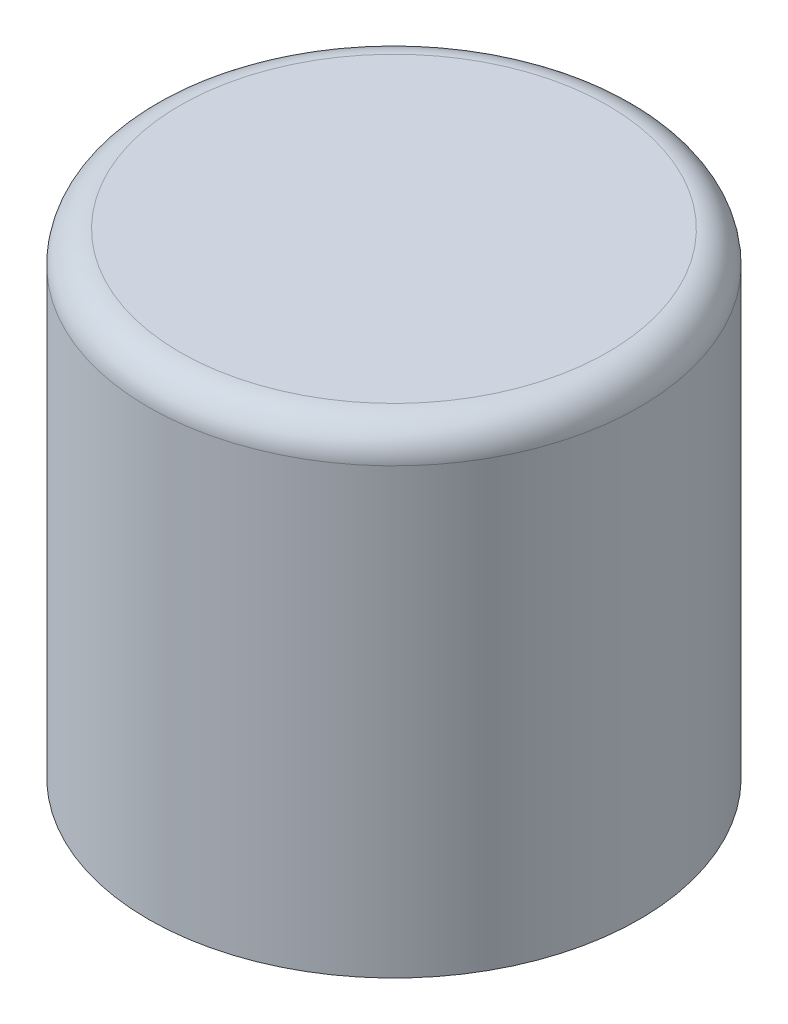
ISO-10303-21;
HEADER;
FILE_DESCRIPTION(('STEP AP214'),'2;1');
FILE_NAME('part.step','',(''),(''),'','','');
FILE_SCHEMA(('AUTOMOTIVE_DESIGN { 1 0 10303 214 1 1 1 1 }'));
ENDSEC;
DATA;
#1=APPLICATION_CONTEXT('core data for automotive mechanical design processes');
#2=APPLICATION_PROTOCOL_DEFINITION('international standard','automotive_design',2000,#1);
#3=PRODUCT_CONTEXT('',#1,'mechanical');
#4=PRODUCT('Part','Part','',(#3));
#5=PRODUCT_RELATED_PRODUCT_CATEGORY('part','',(#4));
#6=PRODUCT_DEFINITION_FORMATION('','',#4);
#7=PRODUCT_DEFINITION_CONTEXT('part definition',#1,'design');
#8=PRODUCT_DEFINITION('design','',#6,#7);
#9=PRODUCT_DEFINITION_SHAPE('','',#8);
#10=(LENGTH_UNIT() NAMED_UNIT(*) SI_UNIT(.MILLI.,.METRE.));
#11=(NAMED_UNIT(*) PLANE_ANGLE_UNIT() SI_UNIT($,.RADIAN.));
#12=(NAMED_UNIT(*) SI_UNIT($,.STERADIAN.) SOLID_ANGLE_UNIT());
#13=UNCERTAINTY_MEASURE_WITH_UNIT(LENGTH_MEASURE(1.E-05),#10,'distance_accuracy_value','');
#14=(GEOMETRIC_REPRESENTATION_CONTEXT(3) GLOBAL_UNCERTAINTY_ASSIGNED_CONTEXT((#13)) GLOBAL_UNIT_ASSIGNED_CONTEXT((#10,
#11,#12)) REPRESENTATION_CONTEXT('',''));
#15=CARTESIAN_POINT('',(0.,0.,0.));
#16=DIRECTION('',(0.,0.,1.));
#17=DIRECTION('',(1.,0.,0.));
#18=AXIS2_PLACEMENT_3D('',#15,#16,#17);
#19=CARTESIAN_POINT('',(0.,0.,0.));
#20=DIRECTION('',(0.,1.,0.));
#21=DIRECTION('',(0.,0.,1.));
#22=AXIS2_PLACEMENT_3D('',#19,#20,#21);
#23=PLANE('',#22);
#24=CARTESIAN_POINT('',(0.,0.,0.));
#25=DIRECTION('',(0.,1.,0.));
#26=DIRECTION('',(0.,0.,1.));
#27=AXIS2_PLACEMENT_3D('',#24,#25,#26);
#28=CIRCLE('',#27,3.1);
#29=CARTESIAN_POINT('',(0.,0.,3.1));
#30=VERTEX_POINT('',#29);
#31=EDGE_CURVE('E42',#30,#30,#28,.T.);
#32=ORIENTED_EDGE('',*,*,#31,.F.);
#33=EDGE_LOOP('',(#32));
#34=FACE_BOUND('',#33,.T.);
#35=CARTESIAN_POINT('',(0.,0.,0.));
#36=DIRECTION('',(0.,1.,0.));
#37=DIRECTION('',(0.,0.,1.));
#38=AXIS2_PLACEMENT_3D('',#35,#36,#37);
#39=CIRCLE('',#38,1.7);
#40=CARTESIAN_POINT('',(0.,0.,1.7));
#41=VERTEX_POINT('',#40);
#42=EDGE_CURVE('E46',#41,#41,#39,.T.);
#43=ORIENTED_EDGE('',*,*,#42,.T.);
#44=EDGE_LOOP('',(#43));
#45=FACE_BOUND('',#44,.T.);
#46=ADVANCED_FACE('F31',(#34,#45),#23,.F.);
#47=CARTESIAN_POINT('',(0.,5.,0.));
#48=DIRECTION('',(0.,-1.,0.));
#49=DIRECTION('',(0.,0.,-1.));
#50=AXIS2_PLACEMENT_3D('',#47,#48,#49);
#51=CYLINDRICAL_SURFACE('',#50,3.1);
#52=CARTESIAN_POINT('',(0.,5.6,0.));
#53=DIRECTION('',(0.,1.,0.));
#54=DIRECTION('',(0.,0.,1.));
#55=AXIS2_PLACEMENT_3D('',#52,#53,#54);
#56=CIRCLE('',#55,3.1);
#57=CARTESIAN_POINT('',(0.,5.6,3.1));
#58=VERTEX_POINT('',#57);
#59=EDGE_CURVE('E10',#58,#58,#56,.F.);
#60=ORIENTED_EDGE('',*,*,#59,.T.);
#61=EDGE_LOOP('',(#60));
#62=FACE_BOUND('',#61,.T.);
#63=ORIENTED_EDGE('',*,*,#31,.T.);
#64=EDGE_LOOP('',(#63));
#65=FACE_BOUND('',#64,.T.);
#66=ADVANCED_FACE('F67',(#62,#65),#51,.T.);
#67=CARTESIAN_POINT('',(0.,5.,0.));
#68=DIRECTION('',(0.,-1.,0.));
#69=DIRECTION('',(0.,0.,-1.));
#70=AXIS2_PLACEMENT_3D('',#67,#68,#69);
#71=CYLINDRICAL_SURFACE('',#70,1.7);
#72=CARTESIAN_POINT('',(0.,5.,0.));
#73=DIRECTION('',(0.,1.,0.));
#74=DIRECTION('',(0.,0.,1.));
#75=AXIS2_PLACEMENT_3D('',#72,#73,#74);
#76=CIRCLE('',#75,1.7);
#77=CARTESIAN_POINT('',(0.,5.,1.7));
#78=VERTEX_POINT('',#77);
#79=EDGE_CURVE('E51',#78,#78,#76,.T.);
#80=ORIENTED_EDGE('',*,*,#79,.T.);
#81=EDGE_LOOP('',(#80));
#82=FACE_BOUND('',#81,.T.);
#83=ORIENTED_EDGE('',*,*,#42,.F.);
#84=EDGE_LOOP('',(#83));
#85=FACE_BOUND('',#84,.T.);
#86=ADVANCED_FACE('F55',(#82,#85),#71,.F.);
#87=CARTESIAN_POINT('',(0.,5.,0.));
#88=DIRECTION('',(0.,1.,0.));
#89=DIRECTION('',(0.,0.,1.));
#90=AXIS2_PLACEMENT_3D('',#87,#88,#89);
#91=PLANE('',#90);
#92=ORIENTED_EDGE('',*,*,#79,.F.);
#93=EDGE_LOOP('',(#92));
#94=FACE_BOUND('',#93,.T.);
#95=ADVANCED_FACE('F58',(#94),#91,.F.);
#96=CARTESIAN_POINT('',(0.,6.,0.));
#97=DIRECTION('',(0.,1.,0.));
#98=DIRECTION('',(0.,0.,1.));
#99=AXIS2_PLACEMENT_3D('',#96,#97,#98);
#100=PLANE('',#99);
#101=CARTESIAN_POINT('',(0.,6.,0.));
#102=DIRECTION('',(0.,1.,0.));
#103=DIRECTION('',(0.,0.,1.));
#104=AXIS2_PLACEMENT_3D('',#101,#102,#103);
#105=CIRCLE('',#104,2.7);
#106=CARTESIAN_POINT('',(0.,6.,2.7));
#107=VERTEX_POINT('',#106);
#108=EDGE_CURVE('E38',#107,#107,#105,.T.);
#109=ORIENTED_EDGE('',*,*,#108,.T.);
#110=EDGE_LOOP('',(#109));
#111=FACE_BOUND('',#110,.T.);
#112=ADVANCED_FACE('F60',(#111),#100,.T.);
#113=CARTESIAN_POINT('',(0.,5.6,0.));
#114=DIRECTION('',(0.,1.,0.));
#115=DIRECTION('',(0.,0.,1.));
#116=AXIS2_PLACEMENT_3D('',#113,#114,#115);
#117=TOROIDAL_SURFACE('',#116,2.7,0.4);
#118=ORIENTED_EDGE('',*,*,#59,.F.);
#119=EDGE_LOOP('',(#118));
#120=FACE_BOUND('',#119,.T.);
#121=ORIENTED_EDGE('',*,*,#108,.F.);
#122=EDGE_LOOP('',(#121));
#123=FACE_BOUND('',#122,.T.);
#124=ADVANCED_FACE('F33',(#120,#123),#117,.T.);
#125=CLOSED_SHELL('',(#46,#66,#86,#95,#112,#124));
#126=MANIFOLD_SOLID_BREP('B2',#125);
#127=ADVANCED_BREP_SHAPE_REPRESENTATION('',(#18,#126),#14);
#128=SHAPE_DEFINITION_REPRESENTATION(#9,#127);
ENDSEC;
END-ISO-10303-21;
